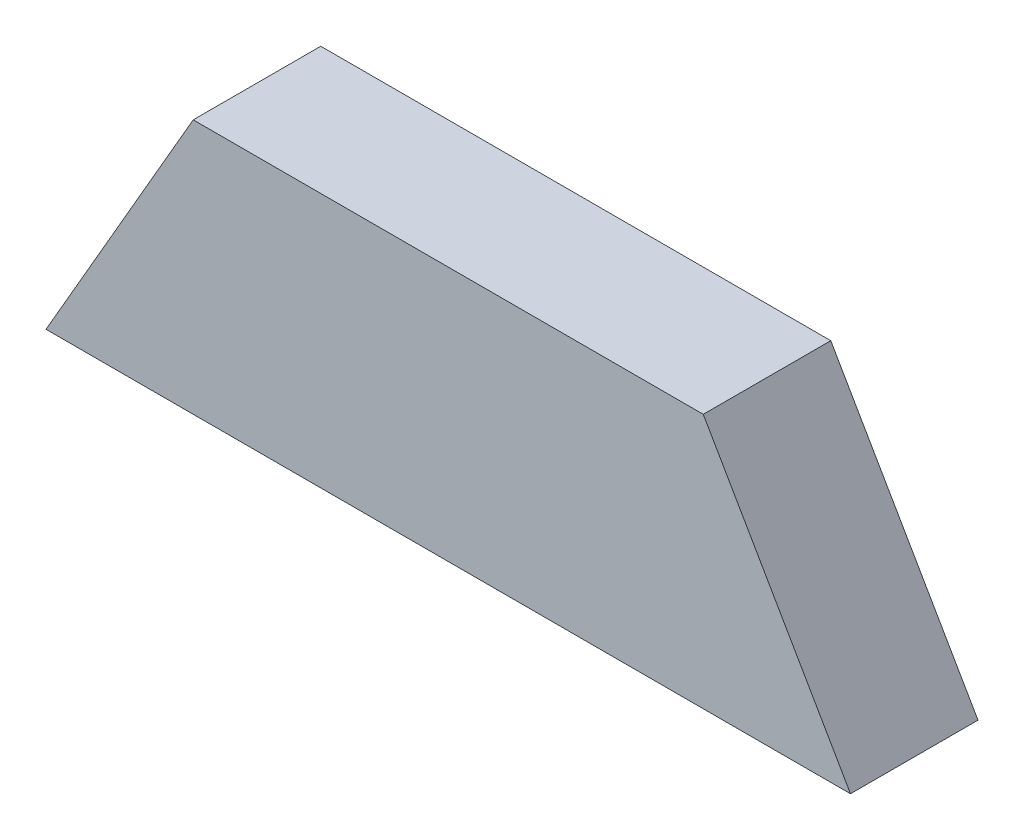
ISO-10303-21;
HEADER;
FILE_DESCRIPTION(('STEP AP214'),'2;1');
FILE_NAME('part.step','',(''),(''),'','','');
FILE_SCHEMA(('AUTOMOTIVE_DESIGN { 1 0 10303 214 1 1 1 1 }'));
ENDSEC;
DATA;
#1=APPLICATION_CONTEXT('core data for automotive mechanical design processes');
#2=APPLICATION_PROTOCOL_DEFINITION('international standard','automotive_design',2000,#1);
#3=PRODUCT_CONTEXT('',#1,'mechanical');
#4=PRODUCT('Part','Part','',(#3));
#5=PRODUCT_RELATED_PRODUCT_CATEGORY('part','',(#4));
#6=PRODUCT_DEFINITION_FORMATION('','',#4);
#7=PRODUCT_DEFINITION_CONTEXT('part definition',#1,'design');
#8=PRODUCT_DEFINITION('design','',#6,#7);
#9=PRODUCT_DEFINITION_SHAPE('','',#8);
#10=(LENGTH_UNIT() NAMED_UNIT(*) SI_UNIT(.MILLI.,.METRE.));
#11=(NAMED_UNIT(*) PLANE_ANGLE_UNIT() SI_UNIT($,.RADIAN.));
#12=(NAMED_UNIT(*) SI_UNIT($,.STERADIAN.) SOLID_ANGLE_UNIT());
#13=UNCERTAINTY_MEASURE_WITH_UNIT(LENGTH_MEASURE(1.E-05),#10,'distance_accuracy_value','');
#14=(GEOMETRIC_REPRESENTATION_CONTEXT(3) GLOBAL_UNCERTAINTY_ASSIGNED_CONTEXT((#13)) GLOBAL_UNIT_ASSIGNED_CONTEXT((#10,
#11,#12)) REPRESENTATION_CONTEXT('',''));
#15=CARTESIAN_POINT('',(0.,0.,0.));
#16=DIRECTION('',(0.,0.,1.));
#17=DIRECTION('',(1.,0.,0.));
#18=AXIS2_PLACEMENT_3D('',#15,#16,#17);
#19=CARTESIAN_POINT('',(-10.0161742093542,-6.35,3.175));
#20=DIRECTION('',(0.866025403784436,-0.500000000000004,0.));
#21=DIRECTION('',(0.500000000000004,0.866025403784437,0.));
#22=AXIS2_PLACEMENT_3D('',#19,#20,#21);
#23=PLANE('',#22);
#24=DIRECTION('',(-0.500000000000004,-0.866025403784436,0.));
#25=VECTOR('',#24,1.);
#26=CARTESIAN_POINT('',(-10.0161742093542,-6.35,0.));
#27=LINE('',#26,#25);
#28=CARTESIAN_POINT('',(-6.35,0.,0.));
#29=VERTEX_POINT('',#28);
#30=CARTESIAN_POINT('',(-10.0161742093542,-6.35,0.));
#31=VERTEX_POINT('',#30);
#32=EDGE_CURVE('E102',#29,#31,#27,.T.);
#33=ORIENTED_EDGE('',*,*,#32,.T.);
#34=DIRECTION('',(0.,0.,-1.));
#35=VECTOR('',#34,1.);
#36=CARTESIAN_POINT('',(-10.0161742093542,-6.35,3.175));
#37=LINE('',#36,#35);
#38=CARTESIAN_POINT('',(-10.0161742093542,-6.35,3.175));
#39=VERTEX_POINT('',#38);
#40=EDGE_CURVE('E11',#39,#31,#37,.T.);
#41=ORIENTED_EDGE('',*,*,#40,.F.);
#42=DIRECTION('',(-0.500000000000004,-0.866025403784436,0.));
#43=VECTOR('',#42,1.);
#44=CARTESIAN_POINT('',(-10.0161742093542,-6.35,3.175));
#45=LINE('',#44,#43);
#46=CARTESIAN_POINT('',(-6.35,0.,3.175));
#47=VERTEX_POINT('',#46);
#48=EDGE_CURVE('E90',#47,#39,#45,.T.);
#49=ORIENTED_EDGE('',*,*,#48,.F.);
#50=DIRECTION('',(0.,0.,-1.));
#51=VECTOR('',#50,1.);
#52=CARTESIAN_POINT('',(-6.35,0.,3.175));
#53=LINE('',#52,#51);
#54=EDGE_CURVE('E98',#47,#29,#53,.T.);
#55=ORIENTED_EDGE('',*,*,#54,.T.);
#56=EDGE_LOOP('',(#33,#41,#49,#55));
#57=FACE_BOUND('',#56,.T.);
#58=ADVANCED_FACE('F39',(#57),#23,.F.);
#59=CARTESIAN_POINT('',(10.0161742093542,-6.35,3.175));
#60=DIRECTION('',(0.,1.,0.));
#61=DIRECTION('',(-1.,0.,0.));
#62=AXIS2_PLACEMENT_3D('',#59,#60,#61);
#63=PLANE('',#62);
#64=DIRECTION('',(1.,0.,0.));
#65=VECTOR('',#64,1.);
#66=CARTESIAN_POINT('',(10.0161742093542,-6.35,0.));
#67=LINE('',#66,#65);
#68=CARTESIAN_POINT('',(10.0161742093542,-6.35,0.));
#69=VERTEX_POINT('',#68);
#70=EDGE_CURVE('E94',#31,#69,#67,.T.);
#71=ORIENTED_EDGE('',*,*,#70,.T.);
#72=DIRECTION('',(0.,0.,-1.));
#73=VECTOR('',#72,1.);
#74=CARTESIAN_POINT('',(10.0161742093542,-6.35,3.175));
#75=LINE('',#74,#73);
#76=CARTESIAN_POINT('',(10.0161742093542,-6.35,3.175));
#77=VERTEX_POINT('',#76);
#78=EDGE_CURVE('E47',#77,#69,#75,.T.);
#79=ORIENTED_EDGE('',*,*,#78,.F.);
#80=DIRECTION('',(1.,0.,0.));
#81=VECTOR('',#80,1.);
#82=CARTESIAN_POINT('',(10.0161742093542,-6.35,3.175));
#83=LINE('',#82,#81);
#84=EDGE_CURVE('E85',#39,#77,#83,.T.);
#85=ORIENTED_EDGE('',*,*,#84,.F.);
#86=ORIENTED_EDGE('',*,*,#40,.T.);
#87=EDGE_LOOP('',(#71,#79,#85,#86));
#88=FACE_BOUND('',#87,.T.);
#89=ADVANCED_FACE('F93',(#88),#63,.F.);
#90=CARTESIAN_POINT('',(6.35,0.,3.175));
#91=DIRECTION('',(-0.866025403784436,-0.500000000000004,0.));
#92=DIRECTION('',(0.500000000000004,-0.866025403784437,0.));
#93=AXIS2_PLACEMENT_3D('',#90,#91,#92);
#94=PLANE('',#93);
#95=DIRECTION('',(-0.500000000000004,0.866025403784437,0.));
#96=VECTOR('',#95,1.);
#97=CARTESIAN_POINT('',(6.35,0.,0.));
#98=LINE('',#97,#96);
#99=CARTESIAN_POINT('',(6.35,0.,0.));
#100=VERTEX_POINT('',#99);
#101=EDGE_CURVE('E72',#69,#100,#98,.T.);
#102=ORIENTED_EDGE('',*,*,#101,.T.);
#103=DIRECTION('',(0.,0.,-1.));
#104=VECTOR('',#103,1.);
#105=CARTESIAN_POINT('',(6.35,0.,3.175));
#106=LINE('',#105,#104);
#107=CARTESIAN_POINT('',(6.35,0.,3.175));
#108=VERTEX_POINT('',#107);
#109=EDGE_CURVE('E95',#108,#100,#106,.T.);
#110=ORIENTED_EDGE('',*,*,#109,.F.);
#111=DIRECTION('',(-0.500000000000004,0.866025403784437,0.));
#112=VECTOR('',#111,1.);
#113=CARTESIAN_POINT('',(6.35,0.,3.175));
#114=LINE('',#113,#112);
#115=EDGE_CURVE('E88',#77,#108,#114,.T.);
#116=ORIENTED_EDGE('',*,*,#115,.F.);
#117=ORIENTED_EDGE('',*,*,#78,.T.);
#118=EDGE_LOOP('',(#102,#110,#116,#117));
#119=FACE_BOUND('',#118,.T.);
#120=ADVANCED_FACE('F96',(#119),#94,.F.);
#121=CARTESIAN_POINT('',(-6.35,0.,3.175));
#122=DIRECTION('',(0.,-1.,0.));
#123=DIRECTION('',(0.,0.,-1.));
#124=AXIS2_PLACEMENT_3D('',#121,#122,#123);
#125=PLANE('',#124);
#126=DIRECTION('',(-1.,0.,0.));
#127=VECTOR('',#126,1.);
#128=CARTESIAN_POINT('',(-6.35,0.,0.));
#129=LINE('',#128,#127);
#130=EDGE_CURVE('E78',#100,#29,#129,.T.);
#131=ORIENTED_EDGE('',*,*,#130,.T.);
#132=ORIENTED_EDGE('',*,*,#54,.F.);
#133=DIRECTION('',(-1.,0.,0.));
#134=VECTOR('',#133,1.);
#135=CARTESIAN_POINT('',(-6.35,0.,3.175));
#136=LINE('',#135,#134);
#137=EDGE_CURVE('E55',#108,#47,#136,.T.);
#138=ORIENTED_EDGE('',*,*,#137,.F.);
#139=ORIENTED_EDGE('',*,*,#109,.T.);
#140=EDGE_LOOP('',(#131,#132,#138,#139));
#141=FACE_BOUND('',#140,.T.);
#142=ADVANCED_FACE('F109',(#141),#125,.F.);
#143=CARTESIAN_POINT('',(0.,0.,3.175));
#144=DIRECTION('',(0.,0.,-1.));
#145=DIRECTION('',(-1.,0.,0.));
#146=AXIS2_PLACEMENT_3D('',#143,#144,#145);
#147=PLANE('',#146);
#148=ORIENTED_EDGE('',*,*,#48,.T.);
#149=ORIENTED_EDGE('',*,*,#84,.T.);
#150=ORIENTED_EDGE('',*,*,#115,.T.);
#151=ORIENTED_EDGE('',*,*,#137,.T.);
#152=EDGE_LOOP('',(#148,#149,#150,#151));
#153=FACE_BOUND('',#152,.T.);
#154=ADVANCED_FACE('F86',(#153),#147,.F.);
#155=CARTESIAN_POINT('',(0.,0.,0.));
#156=DIRECTION('',(0.,0.,-1.));
#157=DIRECTION('',(-1.,0.,0.));
#158=AXIS2_PLACEMENT_3D('',#155,#156,#157);
#159=PLANE('',#158);
#160=ORIENTED_EDGE('',*,*,#32,.F.);
#161=ORIENTED_EDGE('',*,*,#130,.F.);
#162=ORIENTED_EDGE('',*,*,#101,.F.);
#163=ORIENTED_EDGE('',*,*,#70,.F.);
#164=EDGE_LOOP('',(#160,#161,#162,#163));
#165=FACE_BOUND('',#164,.T.);
#166=ADVANCED_FACE('F112',(#165),#159,.T.);
#167=CLOSED_SHELL('',(#58,#89,#120,#142,#154,#166));
#168=MANIFOLD_SOLID_BREP('B2',#167);
#169=ADVANCED_BREP_SHAPE_REPRESENTATION('',(#18,#168),#14);
#170=SHAPE_DEFINITION_REPRESENTATION(#9,#169);
ENDSEC;
END-ISO-10303-21;
